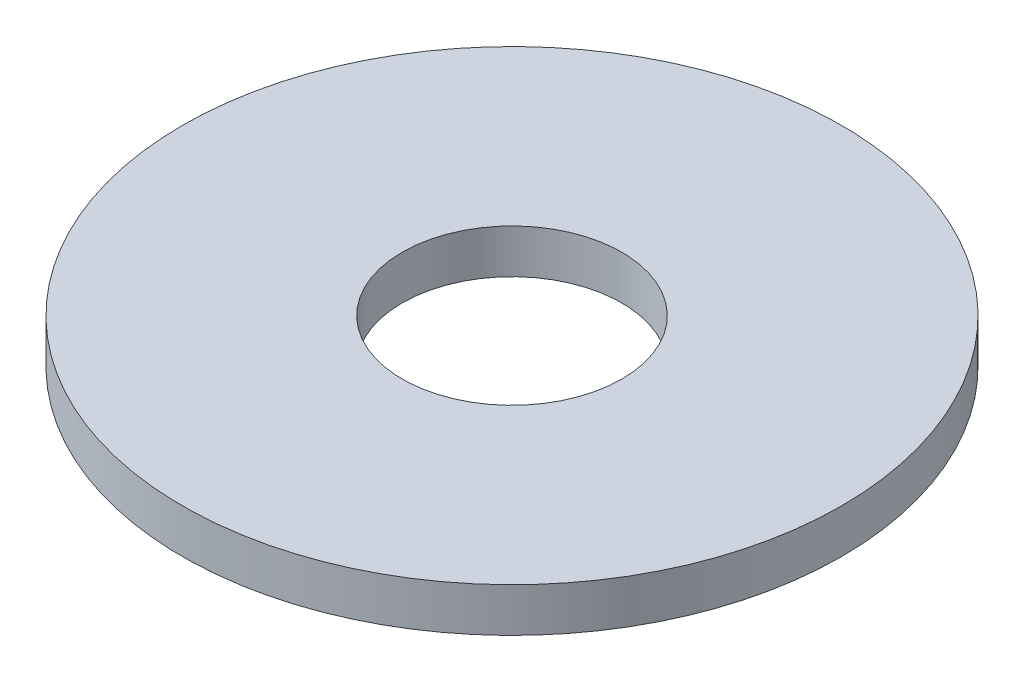
ISO-10303-21;
HEADER;
FILE_DESCRIPTION(('STEP AP214'),'2;1');
FILE_NAME('part.step','',(''),(''),'','','');
FILE_SCHEMA(('AUTOMOTIVE_DESIGN { 1 0 10303 214 1 1 1 1 }'));
ENDSEC;
DATA;
#1=APPLICATION_CONTEXT('core data for automotive mechanical design processes');
#2=APPLICATION_PROTOCOL_DEFINITION('international standard','automotive_design',2000,#1);
#3=PRODUCT_CONTEXT('',#1,'mechanical');
#4=PRODUCT('Part','Part','',(#3));
#5=PRODUCT_RELATED_PRODUCT_CATEGORY('part','',(#4));
#6=PRODUCT_DEFINITION_FORMATION('','',#4);
#7=PRODUCT_DEFINITION_CONTEXT('part definition',#1,'design');
#8=PRODUCT_DEFINITION('design','',#6,#7);
#9=PRODUCT_DEFINITION_SHAPE('','',#8);
#10=(LENGTH_UNIT() NAMED_UNIT(*) SI_UNIT(.MILLI.,.METRE.));
#11=(NAMED_UNIT(*) PLANE_ANGLE_UNIT() SI_UNIT($,.RADIAN.));
#12=(NAMED_UNIT(*) SI_UNIT($,.STERADIAN.) SOLID_ANGLE_UNIT());
#13=UNCERTAINTY_MEASURE_WITH_UNIT(LENGTH_MEASURE(1.E-05),#10,'distance_accuracy_value','');
#14=(GEOMETRIC_REPRESENTATION_CONTEXT(3) GLOBAL_UNCERTAINTY_ASSIGNED_CONTEXT((#13)) GLOBAL_UNIT_ASSIGNED_CONTEXT((#10,
#11,#12)) REPRESENTATION_CONTEXT('',''));
#15=CARTESIAN_POINT('',(0.,0.,0.));
#16=DIRECTION('',(0.,0.,1.));
#17=DIRECTION('',(1.,0.,0.));
#18=AXIS2_PLACEMENT_3D('',#15,#16,#17);
#19=CARTESIAN_POINT('',(0.,2.,0.));
#20=DIRECTION('',(0.,-1.,0.));
#21=DIRECTION('',(0.,0.,-1.));
#22=AXIS2_PLACEMENT_3D('',#19,#20,#21);
#23=CYLINDRICAL_SURFACE('',#22,5.);
#24=CARTESIAN_POINT('',(0.,2.,0.));
#25=DIRECTION('',(0.,1.,0.));
#26=DIRECTION('',(1.,0.,0.));
#27=AXIS2_PLACEMENT_3D('',#24,#25,#26);
#28=CIRCLE('',#27,5.);
#29=CARTESIAN_POINT('',(5.,2.,0.));
#30=VERTEX_POINT('',#29);
#31=EDGE_CURVE('E10',#30,#30,#28,.T.);
#32=ORIENTED_EDGE('',*,*,#31,.T.);
#33=EDGE_LOOP('',(#32));
#34=FACE_BOUND('',#33,.T.);
#35=CARTESIAN_POINT('',(0.,0.,0.));
#36=DIRECTION('',(0.,1.,0.));
#37=DIRECTION('',(1.,0.,0.));
#38=AXIS2_PLACEMENT_3D('',#35,#36,#37);
#39=CIRCLE('',#38,5.);
#40=CARTESIAN_POINT('',(5.,0.,0.));
#41=VERTEX_POINT('',#40);
#42=EDGE_CURVE('E19',#41,#41,#39,.T.);
#43=ORIENTED_EDGE('',*,*,#42,.F.);
#44=EDGE_LOOP('',(#43));
#45=FACE_BOUND('',#44,.T.);
#46=ADVANCED_FACE('F15',(#34,#45),#23,.F.);
#47=CARTESIAN_POINT('',(0.,2.,0.));
#48=DIRECTION('',(0.,-1.,0.));
#49=DIRECTION('',(0.,0.,-1.));
#50=AXIS2_PLACEMENT_3D('',#47,#48,#49);
#51=CYLINDRICAL_SURFACE('',#50,15.);
#52=CARTESIAN_POINT('',(0.,2.,0.));
#53=DIRECTION('',(0.,1.,0.));
#54=DIRECTION('',(1.,0.,0.));
#55=AXIS2_PLACEMENT_3D('',#52,#53,#54);
#56=CIRCLE('',#55,15.);
#57=CARTESIAN_POINT('',(15.,2.,0.));
#58=VERTEX_POINT('',#57);
#59=EDGE_CURVE('E23',#58,#58,#56,.T.);
#60=ORIENTED_EDGE('',*,*,#59,.F.);
#61=EDGE_LOOP('',(#60));
#62=FACE_BOUND('',#61,.T.);
#63=CARTESIAN_POINT('',(0.,0.,0.));
#64=DIRECTION('',(0.,1.,0.));
#65=DIRECTION('',(1.,0.,0.));
#66=AXIS2_PLACEMENT_3D('',#63,#64,#65);
#67=CIRCLE('',#66,15.);
#68=CARTESIAN_POINT('',(15.,0.,0.));
#69=VERTEX_POINT('',#68);
#70=EDGE_CURVE('E29',#69,#69,#67,.T.);
#71=ORIENTED_EDGE('',*,*,#70,.T.);
#72=EDGE_LOOP('',(#71));
#73=FACE_BOUND('',#72,.T.);
#74=ADVANCED_FACE('F17',(#62,#73),#51,.T.);
#75=CARTESIAN_POINT('',(0.,2.,0.));
#76=DIRECTION('',(0.,1.,0.));
#77=DIRECTION('',(0.,0.,1.));
#78=AXIS2_PLACEMENT_3D('',#75,#76,#77);
#79=PLANE('',#78);
#80=ORIENTED_EDGE('',*,*,#31,.F.);
#81=EDGE_LOOP('',(#80));
#82=FACE_BOUND('',#81,.T.);
#83=ORIENTED_EDGE('',*,*,#59,.T.);
#84=EDGE_LOOP('',(#83));
#85=FACE_BOUND('',#84,.T.);
#86=ADVANCED_FACE('F49',(#82,#85),#79,.T.);
#87=CARTESIAN_POINT('',(0.,0.,0.));
#88=DIRECTION('',(0.,1.,0.));
#89=DIRECTION('',(0.,0.,1.));
#90=AXIS2_PLACEMENT_3D('',#87,#88,#89);
#91=PLANE('',#90);
#92=ORIENTED_EDGE('',*,*,#42,.T.);
#93=EDGE_LOOP('',(#92));
#94=FACE_BOUND('',#93,.T.);
#95=ORIENTED_EDGE('',*,*,#70,.F.);
#96=EDGE_LOOP('',(#95));
#97=FACE_BOUND('',#96,.T.);
#98=ADVANCED_FACE('F41',(#94,#97),#91,.F.);
#99=CLOSED_SHELL('',(#46,#74,#86,#98));
#100=MANIFOLD_SOLID_BREP('B1',#99);
#101=ADVANCED_BREP_SHAPE_REPRESENTATION('',(#18,#100),#14);
#102=SHAPE_DEFINITION_REPRESENTATION(#9,#101);
ENDSEC;
END-ISO-10303-21;
